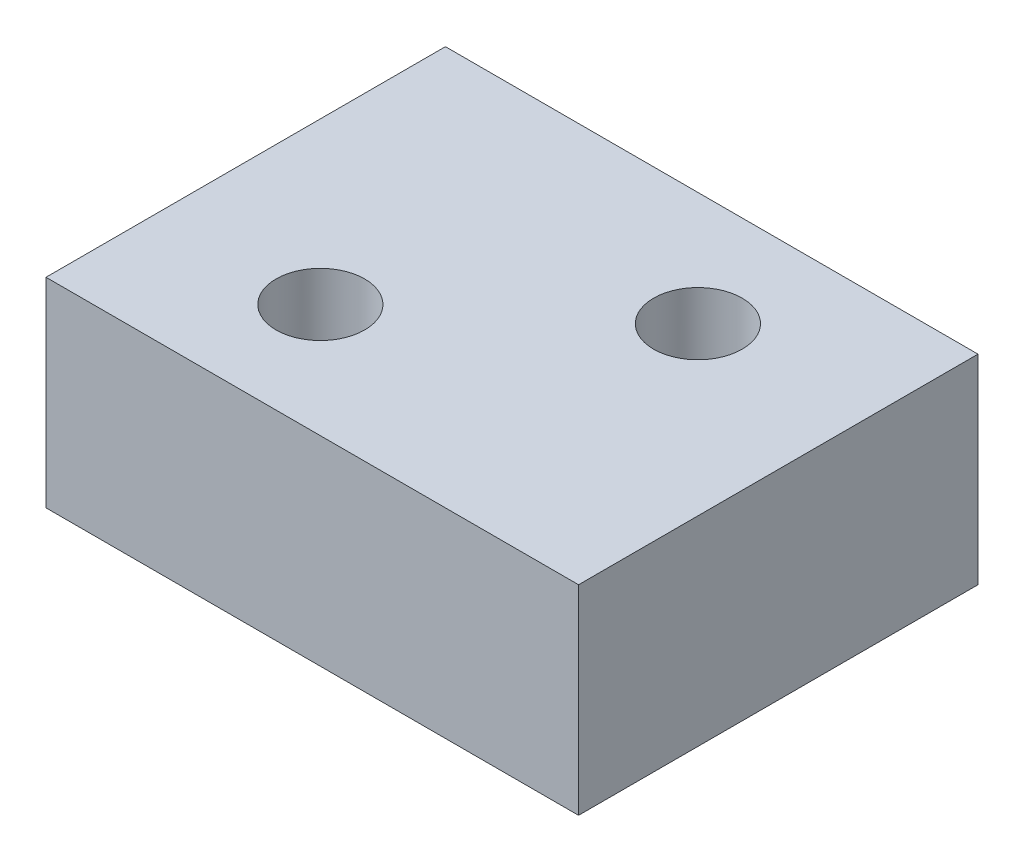
ISO-10303-21;
HEADER;
FILE_DESCRIPTION(('STEP AP214'),'2;1');
FILE_NAME('part.step','',(''),(''),'','','');
FILE_SCHEMA(('AUTOMOTIVE_DESIGN { 1 0 10303 214 1 1 1 1 }'));
ENDSEC;
DATA;
#1=APPLICATION_CONTEXT('core data for automotive mechanical design processes');
#2=APPLICATION_PROTOCOL_DEFINITION('international standard','automotive_design',2000,#1);
#3=PRODUCT_CONTEXT('',#1,'mechanical');
#4=PRODUCT('Part','Part','',(#3));
#5=PRODUCT_RELATED_PRODUCT_CATEGORY('part','',(#4));
#6=PRODUCT_DEFINITION_FORMATION('','',#4);
#7=PRODUCT_DEFINITION_CONTEXT('part definition',#1,'design');
#8=PRODUCT_DEFINITION('design','',#6,#7);
#9=PRODUCT_DEFINITION_SHAPE('','',#8);
#10=(LENGTH_UNIT() NAMED_UNIT(*) SI_UNIT(.MILLI.,.METRE.));
#11=(NAMED_UNIT(*) PLANE_ANGLE_UNIT() SI_UNIT($,.RADIAN.));
#12=(NAMED_UNIT(*) SI_UNIT($,.STERADIAN.) SOLID_ANGLE_UNIT());
#13=UNCERTAINTY_MEASURE_WITH_UNIT(LENGTH_MEASURE(1.E-05),#10,'distance_accuracy_value','');
#14=(GEOMETRIC_REPRESENTATION_CONTEXT(3) GLOBAL_UNCERTAINTY_ASSIGNED_CONTEXT((#13)) GLOBAL_UNIT_ASSIGNED_CONTEXT((#10,
#11,#12)) REPRESENTATION_CONTEXT('',''));
#15=CARTESIAN_POINT('',(0.,0.,0.));
#16=DIRECTION('',(0.,0.,1.));
#17=DIRECTION('',(1.,0.,0.));
#18=AXIS2_PLACEMENT_3D('',#15,#16,#17);
#19=CARTESIAN_POINT('',(20.,10.,15.));
#20=DIRECTION('',(-1.,0.,0.));
#21=DIRECTION('',(0.,0.,1.));
#22=AXIS2_PLACEMENT_3D('',#19,#20,#21);
#23=PLANE('',#22);
#24=DIRECTION('',(0.,0.,-1.));
#25=VECTOR('',#24,1.);
#26=CARTESIAN_POINT('',(20.,0.,15.));
#27=LINE('',#26,#25);
#28=CARTESIAN_POINT('',(20.,0.,15.));
#29=VERTEX_POINT('',#28);
#30=CARTESIAN_POINT('',(20.,0.,-15.));
#31=VERTEX_POINT('',#30);
#32=EDGE_CURVE('E167',#29,#31,#27,.T.);
#33=ORIENTED_EDGE('',*,*,#32,.T.);
#34=DIRECTION('',(0.,-1.,0.));
#35=VECTOR('',#34,1.);
#36=CARTESIAN_POINT('',(20.,10.,-15.));
#37=LINE('',#36,#35);
#38=CARTESIAN_POINT('',(20.,15.,-15.));
#39=VERTEX_POINT('',#38);
#40=EDGE_CURVE('E11',#39,#31,#37,.T.);
#41=ORIENTED_EDGE('',*,*,#40,.F.);
#42=DIRECTION('',(0.,0.,-1.));
#43=VECTOR('',#42,1.);
#44=CARTESIAN_POINT('',(20.,15.,15.));
#45=LINE('',#44,#43);
#46=CARTESIAN_POINT('',(20.,15.,15.));
#47=VERTEX_POINT('',#46);
#48=EDGE_CURVE('E104',#47,#39,#45,.T.);
#49=ORIENTED_EDGE('',*,*,#48,.F.);
#50=DIRECTION('',(0.,-1.,0.));
#51=VECTOR('',#50,1.);
#52=CARTESIAN_POINT('',(20.,10.,15.));
#53=LINE('',#52,#51);
#54=EDGE_CURVE('E95',#47,#29,#53,.T.);
#55=ORIENTED_EDGE('',*,*,#54,.T.);
#56=EDGE_LOOP('',(#33,#41,#49,#55));
#57=FACE_BOUND('',#56,.T.);
#58=ADVANCED_FACE('F47',(#57),#23,.F.);
#59=CARTESIAN_POINT('',(-20.,10.,-15.));
#60=DIRECTION('',(0.,0.,1.));
#61=DIRECTION('',(1.,0.,0.));
#62=AXIS2_PLACEMENT_3D('',#59,#60,#61);
#63=PLANE('',#62);
#64=DIRECTION('',(-1.,0.,0.));
#65=VECTOR('',#64,1.);
#66=CARTESIAN_POINT('',(-20.,0.,-15.));
#67=LINE('',#66,#65);
#68=CARTESIAN_POINT('',(-20.,0.,-15.));
#69=VERTEX_POINT('',#68);
#70=EDGE_CURVE('E174',#31,#69,#67,.T.);
#71=ORIENTED_EDGE('',*,*,#70,.T.);
#72=DIRECTION('',(0.,-1.,0.));
#73=VECTOR('',#72,1.);
#74=CARTESIAN_POINT('',(-20.,10.,-15.));
#75=LINE('',#74,#73);
#76=CARTESIAN_POINT('',(-20.,15.,-15.));
#77=VERTEX_POINT('',#76);
#78=EDGE_CURVE('E56',#77,#69,#75,.T.);
#79=ORIENTED_EDGE('',*,*,#78,.F.);
#80=DIRECTION('',(-1.,0.,0.));
#81=VECTOR('',#80,1.);
#82=CARTESIAN_POINT('',(-20.,15.,-15.));
#83=LINE('',#82,#81);
#84=EDGE_CURVE('E109',#39,#77,#83,.T.);
#85=ORIENTED_EDGE('',*,*,#84,.F.);
#86=ORIENTED_EDGE('',*,*,#40,.T.);
#87=EDGE_LOOP('',(#71,#79,#85,#86));
#88=FACE_BOUND('',#87,.T.);
#89=ADVANCED_FACE('F235',(#88),#63,.F.);
#90=CARTESIAN_POINT('',(-20.,10.,15.));
#91=DIRECTION('',(1.,0.,0.));
#92=DIRECTION('',(0.,0.,-1.));
#93=AXIS2_PLACEMENT_3D('',#90,#91,#92);
#94=PLANE('',#93);
#95=DIRECTION('',(0.,0.,1.));
#96=VECTOR('',#95,1.);
#97=CARTESIAN_POINT('',(-20.,0.,15.));
#98=LINE('',#97,#96);
#99=CARTESIAN_POINT('',(-20.,0.,15.));
#100=VERTEX_POINT('',#99);
#101=EDGE_CURVE('E72',#69,#100,#98,.T.);
#102=ORIENTED_EDGE('',*,*,#101,.T.);
#103=DIRECTION('',(0.,-1.,0.));
#104=VECTOR('',#103,1.);
#105=CARTESIAN_POINT('',(-20.,10.,15.));
#106=LINE('',#105,#104);
#107=CARTESIAN_POINT('',(-20.,15.,15.));
#108=VERTEX_POINT('',#107);
#109=EDGE_CURVE('E89',#108,#100,#106,.T.);
#110=ORIENTED_EDGE('',*,*,#109,.F.);
#111=DIRECTION('',(0.,0.,1.));
#112=VECTOR('',#111,1.);
#113=CARTESIAN_POINT('',(-20.,15.,15.));
#114=LINE('',#113,#112);
#115=EDGE_CURVE('E93',#77,#108,#114,.T.);
#116=ORIENTED_EDGE('',*,*,#115,.F.);
#117=ORIENTED_EDGE('',*,*,#78,.T.);
#118=EDGE_LOOP('',(#102,#110,#116,#117));
#119=FACE_BOUND('',#118,.T.);
#120=ADVANCED_FACE('F91',(#119),#94,.F.);
#121=CARTESIAN_POINT('',(-20.,10.,15.));
#122=DIRECTION('',(0.,0.,-1.));
#123=DIRECTION('',(-1.,0.,0.));
#124=AXIS2_PLACEMENT_3D('',#121,#122,#123);
#125=PLANE('',#124);
#126=DIRECTION('',(1.,0.,0.));
#127=VECTOR('',#126,1.);
#128=CARTESIAN_POINT('',(-20.,0.,15.));
#129=LINE('',#128,#127);
#130=EDGE_CURVE('E64',#100,#29,#129,.T.);
#131=ORIENTED_EDGE('',*,*,#130,.T.);
#132=ORIENTED_EDGE('',*,*,#54,.F.);
#133=DIRECTION('',(1.,0.,0.));
#134=VECTOR('',#133,1.);
#135=CARTESIAN_POINT('',(-20.,15.,15.));
#136=LINE('',#135,#134);
#137=EDGE_CURVE('E98',#108,#47,#136,.T.);
#138=ORIENTED_EDGE('',*,*,#137,.F.);
#139=ORIENTED_EDGE('',*,*,#109,.T.);
#140=EDGE_LOOP('',(#131,#132,#138,#139));
#141=FACE_BOUND('',#140,.T.);
#142=ADVANCED_FACE('F99',(#141),#125,.F.);
#143=CARTESIAN_POINT('',(0.,0.,0.));
#144=DIRECTION('',(0.,-1.,0.));
#145=DIRECTION('',(0.,0.,-1.));
#146=AXIS2_PLACEMENT_3D('',#143,#144,#145);
#147=PLANE('',#146);
#148=CARTESIAN_POINT('',(-13.3333333333333,0.,10.));
#149=DIRECTION('',(0.,-1.,0.));
#150=DIRECTION('',(0.,0.,1.));
#151=AXIS2_PLACEMENT_3D('',#148,#149,#150);
#152=CIRCLE('',#151,2.);
#153=CARTESIAN_POINT('',(-13.3333333333333,0.,12.));
#154=VERTEX_POINT('',#153);
#155=EDGE_CURVE('E147',#154,#154,#152,.T.);
#156=ORIENTED_EDGE('',*,*,#155,.F.);
#157=EDGE_LOOP('',(#156));
#158=FACE_BOUND('',#157,.T.);
#159=CARTESIAN_POINT('',(13.3333333333333,0.,-10.));
#160=DIRECTION('',(0.,-1.,0.));
#161=DIRECTION('',(0.,0.,1.));
#162=AXIS2_PLACEMENT_3D('',#159,#160,#161);
#163=CIRCLE('',#162,2.);
#164=CARTESIAN_POINT('',(13.3333333333333,0.,-8.));
#165=VERTEX_POINT('',#164);
#166=EDGE_CURVE('E156',#165,#165,#163,.T.);
#167=ORIENTED_EDGE('',*,*,#166,.F.);
#168=EDGE_LOOP('',(#167));
#169=FACE_BOUND('',#168,.T.);
#170=CARTESIAN_POINT('',(-13.3333333333333,0.,-9.99999999999999));
#171=DIRECTION('',(0.,-1.,0.));
#172=DIRECTION('',(0.,0.,-1.));
#173=AXIS2_PLACEMENT_3D('',#170,#171,#172);
#174=CIRCLE('',#173,2.);
#175=CARTESIAN_POINT('',(-13.3333333333333,0.,-12.));
#176=VERTEX_POINT('',#175);
#177=EDGE_CURVE('E139',#176,#176,#174,.T.);
#178=ORIENTED_EDGE('',*,*,#177,.F.);
#179=EDGE_LOOP('',(#178));
#180=FACE_BOUND('',#179,.T.);
#181=CARTESIAN_POINT('',(13.3333333333333,0.,10.));
#182=DIRECTION('',(0.,-1.,0.));
#183=DIRECTION('',(0.,0.,-1.));
#184=AXIS2_PLACEMENT_3D('',#181,#182,#183);
#185=CIRCLE('',#184,2.);
#186=CARTESIAN_POINT('',(13.3333333333333,0.,8.));
#187=VERTEX_POINT('',#186);
#188=EDGE_CURVE('E151',#187,#187,#185,.T.);
#189=ORIENTED_EDGE('',*,*,#188,.F.);
#190=EDGE_LOOP('',(#189));
#191=FACE_BOUND('',#190,.T.);
#192=ORIENTED_EDGE('',*,*,#32,.F.);
#193=ORIENTED_EDGE('',*,*,#130,.F.);
#194=ORIENTED_EDGE('',*,*,#101,.F.);
#195=ORIENTED_EDGE('',*,*,#70,.F.);
#196=EDGE_LOOP('',(#192,#193,#194,#195));
#197=FACE_BOUND('',#196,.T.);
#198=ADVANCED_FACE('F244',(#158,#169,#180,#191,#197),#147,.T.);
#199=CARTESIAN_POINT('',(13.3333333333333,5.,10.));
#200=DIRECTION('',(0.,-1.,0.));
#201=DIRECTION('',(0.,0.,-1.));
#202=AXIS2_PLACEMENT_3D('',#199,#200,#201);
#203=CYLINDRICAL_SURFACE('',#202,2.);
#204=CARTESIAN_POINT('',(13.3333333333333,5.,10.));
#205=DIRECTION('',(0.,-1.,0.));
#206=DIRECTION('',(0.,0.,-1.));
#207=AXIS2_PLACEMENT_3D('',#204,#205,#206);
#208=CIRCLE('',#207,2.);
#209=CARTESIAN_POINT('',(13.3333333333333,5.,8.));
#210=VERTEX_POINT('',#209);
#211=EDGE_CURVE('E163',#210,#210,#208,.T.);
#212=ORIENTED_EDGE('',*,*,#211,.F.);
#213=EDGE_LOOP('',(#212));
#214=FACE_BOUND('',#213,.T.);
#215=ORIENTED_EDGE('',*,*,#188,.T.);
#216=EDGE_LOOP('',(#215));
#217=FACE_BOUND('',#216,.T.);
#218=ADVANCED_FACE('F246',(#214,#217),#203,.F.);
#219=CARTESIAN_POINT('',(13.3333333333333,5.,10.));
#220=DIRECTION('',(0.,-1.,0.));
#221=DIRECTION('',(0.,0.,-1.));
#222=AXIS2_PLACEMENT_3D('',#219,#220,#221);
#223=PLANE('',#222);
#224=ORIENTED_EDGE('',*,*,#211,.T.);
#225=EDGE_LOOP('',(#224));
#226=FACE_BOUND('',#225,.T.);
#227=ADVANCED_FACE('F252',(#226),#223,.T.);
#228=CARTESIAN_POINT('',(-13.3333333333333,5.,-9.99999999999999));
#229=DIRECTION('',(0.,-1.,0.));
#230=DIRECTION('',(0.,0.,-1.));
#231=AXIS2_PLACEMENT_3D('',#228,#229,#230);
#232=CYLINDRICAL_SURFACE('',#231,2.);
#233=CARTESIAN_POINT('',(-13.3333333333333,5.,-9.99999999999999));
#234=DIRECTION('',(0.,-1.,0.));
#235=DIRECTION('',(0.,0.,-1.));
#236=AXIS2_PLACEMENT_3D('',#233,#234,#235);
#237=CIRCLE('',#236,2.);
#238=CARTESIAN_POINT('',(-13.3333333333333,5.,-12.));
#239=VERTEX_POINT('',#238);
#240=EDGE_CURVE('E127',#239,#239,#237,.T.);
#241=ORIENTED_EDGE('',*,*,#240,.F.);
#242=EDGE_LOOP('',(#241));
#243=FACE_BOUND('',#242,.T.);
#244=ORIENTED_EDGE('',*,*,#177,.T.);
#245=EDGE_LOOP('',(#244));
#246=FACE_BOUND('',#245,.T.);
#247=ADVANCED_FACE('F372',(#243,#246),#232,.F.);
#248=CARTESIAN_POINT('',(-13.3333333333333,5.,-9.99999999999999));
#249=DIRECTION('',(0.,-1.,0.));
#250=DIRECTION('',(0.,0.,-1.));
#251=AXIS2_PLACEMENT_3D('',#248,#249,#250);
#252=PLANE('',#251);
#253=ORIENTED_EDGE('',*,*,#240,.T.);
#254=EDGE_LOOP('',(#253));
#255=FACE_BOUND('',#254,.T.);
#256=ADVANCED_FACE('F375',(#255),#252,.T.);
#257=CARTESIAN_POINT('',(13.3333333333333,5.,-10.));
#258=DIRECTION('',(0.,-1.,0.));
#259=DIRECTION('',(0.,0.,-1.));
#260=AXIS2_PLACEMENT_3D('',#257,#258,#259);
#261=CYLINDRICAL_SURFACE('',#260,2.);
#262=CARTESIAN_POINT('',(13.3333333333333,5.,-10.));
#263=DIRECTION('',(0.,-1.,0.));
#264=DIRECTION('',(0.,0.,1.));
#265=AXIS2_PLACEMENT_3D('',#262,#263,#264);
#266=CIRCLE('',#265,2.);
#267=CARTESIAN_POINT('',(13.3333333333333,5.,-8.));
#268=VERTEX_POINT('',#267);
#269=EDGE_CURVE('E143',#268,#268,#266,.T.);
#270=ORIENTED_EDGE('',*,*,#269,.F.);
#271=EDGE_LOOP('',(#270));
#272=FACE_BOUND('',#271,.T.);
#273=ORIENTED_EDGE('',*,*,#166,.T.);
#274=EDGE_LOOP('',(#273));
#275=FACE_BOUND('',#274,.T.);
#276=ADVANCED_FACE('F379',(#272,#275),#261,.F.);
#277=CARTESIAN_POINT('',(13.3333333333333,5.,-10.));
#278=DIRECTION('',(0.,1.,0.));
#279=DIRECTION('',(0.,0.,1.));
#280=AXIS2_PLACEMENT_3D('',#277,#278,#279);
#281=PLANE('',#280);
#282=ORIENTED_EDGE('',*,*,#269,.T.);
#283=EDGE_LOOP('',(#282));
#284=FACE_BOUND('',#283,.T.);
#285=ADVANCED_FACE('F384',(#284),#281,.F.);
#286=CARTESIAN_POINT('',(-13.3333333333333,5.,10.));
#287=DIRECTION('',(0.,-1.,0.));
#288=DIRECTION('',(0.,0.,-1.));
#289=AXIS2_PLACEMENT_3D('',#286,#287,#288);
#290=CYLINDRICAL_SURFACE('',#289,2.);
#291=CARTESIAN_POINT('',(-13.3333333333333,5.,10.));
#292=DIRECTION('',(0.,-1.,0.));
#293=DIRECTION('',(0.,0.,1.));
#294=AXIS2_PLACEMENT_3D('',#291,#292,#293);
#295=CIRCLE('',#294,2.);
#296=CARTESIAN_POINT('',(-13.3333333333333,5.,12.));
#297=VERTEX_POINT('',#296);
#298=EDGE_CURVE('E152',#297,#297,#295,.T.);
#299=ORIENTED_EDGE('',*,*,#298,.F.);
#300=EDGE_LOOP('',(#299));
#301=FACE_BOUND('',#300,.T.);
#302=ORIENTED_EDGE('',*,*,#155,.T.);
#303=EDGE_LOOP('',(#302));
#304=FACE_BOUND('',#303,.T.);
#305=ADVANCED_FACE('F381',(#301,#304),#290,.F.);
#306=CARTESIAN_POINT('',(-13.3333333333333,5.,10.));
#307=DIRECTION('',(0.,1.,0.));
#308=DIRECTION('',(0.,0.,1.));
#309=AXIS2_PLACEMENT_3D('',#306,#307,#308);
#310=PLANE('',#309);
#311=ORIENTED_EDGE('',*,*,#298,.T.);
#312=EDGE_LOOP('',(#311));
#313=FACE_BOUND('',#312,.T.);
#314=ADVANCED_FACE('F277',(#313),#310,.F.);
#315=CARTESIAN_POINT('',(0.,15.,0.));
#316=DIRECTION('',(0.,-1.,0.));
#317=DIRECTION('',(0.,0.,-1.));
#318=AXIS2_PLACEMENT_3D('',#315,#316,#317);
#319=PLANE('',#318);
#320=CARTESIAN_POINT('',(-7.9286,15.,6.465));
#321=DIRECTION('',(0.,1.,0.));
#322=DIRECTION('',(0.,0.,1.));
#323=AXIS2_PLACEMENT_3D('',#320,#321,#322);
#324=CIRCLE('',#323,3.325);
#325=CARTESIAN_POINT('',(-7.9286,15.,9.79));
#326=VERTEX_POINT('',#325);
#327=EDGE_CURVE('E188',#326,#326,#324,.T.);
#328=ORIENTED_EDGE('',*,*,#327,.F.);
#329=EDGE_LOOP('',(#328));
#330=FACE_BOUND('',#329,.T.);
#331=CARTESIAN_POINT('',(7.5,15.,-6.4636));
#332=DIRECTION('',(0.,1.,0.));
#333=DIRECTION('',(0.,0.,1.));
#334=AXIS2_PLACEMENT_3D('',#331,#332,#333);
#335=CIRCLE('',#334,3.325);
#336=CARTESIAN_POINT('',(7.5,15.,-3.1386));
#337=VERTEX_POINT('',#336);
#338=EDGE_CURVE('E204',#337,#337,#335,.T.);
#339=ORIENTED_EDGE('',*,*,#338,.F.);
#340=EDGE_LOOP('',(#339));
#341=FACE_BOUND('',#340,.T.);
#342=ORIENTED_EDGE('',*,*,#115,.T.);
#343=ORIENTED_EDGE('',*,*,#137,.T.);
#344=ORIENTED_EDGE('',*,*,#48,.T.);
#345=ORIENTED_EDGE('',*,*,#84,.T.);
#346=EDGE_LOOP('',(#342,#343,#344,#345));
#347=FACE_BOUND('',#346,.T.);
#348=ADVANCED_FACE('F107',(#330,#341,#347),#319,.F.);
#349=CARTESIAN_POINT('',(7.5,15.,-6.4636));
#350=DIRECTION('',(0.,-1.,0.));
#351=DIRECTION('',(0.,0.,-1.));
#352=AXIS2_PLACEMENT_3D('',#349,#350,#351);
#353=CYLINDRICAL_SURFACE('',#352,3.325);
#354=CARTESIAN_POINT('',(7.5,10.,-6.4636));
#355=DIRECTION('',(0.,-1.,0.));
#356=DIRECTION('',(0.,0.,-1.));
#357=AXIS2_PLACEMENT_3D('',#354,#355,#356);
#358=CIRCLE('',#357,3.325);
#359=CARTESIAN_POINT('',(7.5,10.,-9.7886));
#360=VERTEX_POINT('',#359);
#361=EDGE_CURVE('E184',#360,#360,#358,.F.);
#362=ORIENTED_EDGE('',*,*,#361,.F.);
#363=EDGE_LOOP('',(#362));
#364=FACE_BOUND('',#363,.T.);
#365=ORIENTED_EDGE('',*,*,#338,.T.);
#366=EDGE_LOOP('',(#365));
#367=FACE_BOUND('',#366,.T.);
#368=ADVANCED_FACE('F219',(#364,#367),#353,.F.);
#369=CARTESIAN_POINT('',(-7.9286,15.,6.465));
#370=DIRECTION('',(0.,-1.,0.));
#371=DIRECTION('',(0.,0.,-1.));
#372=AXIS2_PLACEMENT_3D('',#369,#370,#371);
#373=CYLINDRICAL_SURFACE('',#372,3.325);
#374=CARTESIAN_POINT('',(-7.9286,10.,6.465));
#375=DIRECTION('',(0.,-1.,0.));
#376=DIRECTION('',(0.,0.,-1.));
#377=AXIS2_PLACEMENT_3D('',#374,#375,#376);
#378=CIRCLE('',#377,3.325);
#379=CARTESIAN_POINT('',(-7.9286,10.,3.14));
#380=VERTEX_POINT('',#379);
#381=EDGE_CURVE('E50',#380,#380,#378,.F.);
#382=ORIENTED_EDGE('',*,*,#381,.F.);
#383=EDGE_LOOP('',(#382));
#384=FACE_BOUND('',#383,.T.);
#385=ORIENTED_EDGE('',*,*,#327,.T.);
#386=EDGE_LOOP('',(#385));
#387=FACE_BOUND('',#386,.T.);
#388=ADVANCED_FACE('F232',(#384,#387),#373,.F.);
#389=CARTESIAN_POINT('',(7.5,6.,-6.4636));
#390=DIRECTION('',(0.,1.,0.));
#391=DIRECTION('',(0.,0.,1.));
#392=AXIS2_PLACEMENT_3D('',#389,#390,#391);
#393=PLANE('',#392);
#394=CARTESIAN_POINT('',(7.5,6.,-6.4636));
#395=DIRECTION('',(0.,1.,0.));
#396=DIRECTION('',(0.,0.,1.));
#397=AXIS2_PLACEMENT_3D('',#394,#395,#396);
#398=CIRCLE('',#397,3.325);
#399=CARTESIAN_POINT('',(7.5,6.,-3.1386));
#400=VERTEX_POINT('',#399);
#401=EDGE_CURVE('E187',#400,#400,#398,.F.);
#402=ORIENTED_EDGE('',*,*,#401,.T.);
#403=EDGE_LOOP('',(#402));
#404=FACE_BOUND('',#403,.T.);
#405=CARTESIAN_POINT('',(7.5,6.,-6.4636));
#406=DIRECTION('',(0.,1.,0.));
#407=DIRECTION('',(0.,0.,1.));
#408=AXIS2_PLACEMENT_3D('',#405,#406,#407);
#409=CIRCLE('',#408,4.8125);
#410=CARTESIAN_POINT('',(7.5,6.,-1.6511));
#411=VERTEX_POINT('',#410);
#412=EDGE_CURVE('E128',#411,#411,#409,.T.);
#413=ORIENTED_EDGE('',*,*,#412,.T.);
#414=EDGE_LOOP('',(#413));
#415=FACE_BOUND('',#414,.T.);
#416=ADVANCED_FACE('F294',(#404,#415),#393,.T.);
#417=CARTESIAN_POINT('',(7.5,6.,-6.4636));
#418=DIRECTION('',(0.,1.,0.));
#419=DIRECTION('',(0.,0.,1.));
#420=AXIS2_PLACEMENT_3D('',#417,#418,#419);
#421=CYLINDRICAL_SURFACE('',#420,4.8125);
#422=ORIENTED_EDGE('',*,*,#412,.F.);
#423=EDGE_LOOP('',(#422));
#424=FACE_BOUND('',#423,.T.);
#425=CARTESIAN_POINT('',(7.5,10.,-6.4636));
#426=DIRECTION('',(0.,1.,0.));
#427=DIRECTION('',(0.,0.,1.));
#428=AXIS2_PLACEMENT_3D('',#425,#426,#427);
#429=CIRCLE('',#428,4.8125);
#430=CARTESIAN_POINT('',(7.5,10.,-1.6511));
#431=VERTEX_POINT('',#430);
#432=EDGE_CURVE('E122',#431,#431,#429,.T.);
#433=ORIENTED_EDGE('',*,*,#432,.T.);
#434=EDGE_LOOP('',(#433));
#435=FACE_BOUND('',#434,.T.);
#436=ADVANCED_FACE('F226',(#424,#435),#421,.F.);
#437=CARTESIAN_POINT('',(0.,10.,0.));
#438=DIRECTION('',(0.,-1.,0.));
#439=DIRECTION('',(0.,0.,-1.));
#440=AXIS2_PLACEMENT_3D('',#437,#438,#439);
#441=PLANE('',#440);
#442=ORIENTED_EDGE('',*,*,#361,.T.);
#443=EDGE_LOOP('',(#442));
#444=FACE_BOUND('',#443,.T.);
#445=ORIENTED_EDGE('',*,*,#432,.F.);
#446=EDGE_LOOP('',(#445));
#447=FACE_BOUND('',#446,.T.);
#448=ADVANCED_FACE('F216',(#444,#447),#441,.T.);
#449=ORIENTED_EDGE('',*,*,#401,.F.);
#450=EDGE_LOOP('',(#449));
#451=FACE_BOUND('',#450,.T.);
#452=CARTESIAN_POINT('',(7.5,5.,-6.4636));
#453=DIRECTION('',(0.,1.,0.));
#454=DIRECTION('',(0.,0.,1.));
#455=AXIS2_PLACEMENT_3D('',#452,#453,#454);
#456=CIRCLE('',#455,3.325);
#457=CARTESIAN_POINT('',(7.5,5.,-3.1386));
#458=VERTEX_POINT('',#457);
#459=EDGE_CURVE('E201',#458,#458,#456,.T.);
#460=ORIENTED_EDGE('',*,*,#459,.F.);
#461=EDGE_LOOP('',(#460));
#462=FACE_BOUND('',#461,.T.);
#463=ADVANCED_FACE('F214',(#451,#462),#353,.F.);
#464=CARTESIAN_POINT('',(7.5,5.,-6.4636));
#465=DIRECTION('',(0.,1.,0.));
#466=DIRECTION('',(0.,0.,1.));
#467=AXIS2_PLACEMENT_3D('',#464,#465,#466);
#468=PLANE('',#467);
#469=ORIENTED_EDGE('',*,*,#459,.T.);
#470=EDGE_LOOP('',(#469));
#471=FACE_BOUND('',#470,.T.);
#472=ADVANCED_FACE('F212',(#471),#468,.T.);
#473=CARTESIAN_POINT('',(-7.9286,6.,6.465));
#474=DIRECTION('',(0.,1.,0.));
#475=DIRECTION('',(0.,0.,1.));
#476=AXIS2_PLACEMENT_3D('',#473,#474,#475);
#477=PLANE('',#476);
#478=CARTESIAN_POINT('',(-7.9286,6.,6.465));
#479=DIRECTION('',(0.,1.,0.));
#480=DIRECTION('',(0.,0.,1.));
#481=AXIS2_PLACEMENT_3D('',#478,#479,#480);
#482=CIRCLE('',#481,3.325);
#483=CARTESIAN_POINT('',(-7.9286,6.,9.79));
#484=VERTEX_POINT('',#483);
#485=EDGE_CURVE('E111',#484,#484,#482,.F.);
#486=ORIENTED_EDGE('',*,*,#485,.T.);
#487=EDGE_LOOP('',(#486));
#488=FACE_BOUND('',#487,.T.);
#489=CARTESIAN_POINT('',(-7.9286,6.,6.465));
#490=DIRECTION('',(0.,1.,0.));
#491=DIRECTION('',(0.,0.,1.));
#492=AXIS2_PLACEMENT_3D('',#489,#490,#491);
#493=CIRCLE('',#492,4.8125);
#494=CARTESIAN_POINT('',(-7.9286,6.,11.2775));
#495=VERTEX_POINT('',#494);
#496=EDGE_CURVE('E123',#495,#495,#493,.T.);
#497=ORIENTED_EDGE('',*,*,#496,.T.);
#498=EDGE_LOOP('',(#497));
#499=FACE_BOUND('',#498,.T.);
#500=ADVANCED_FACE('F224',(#488,#499),#477,.T.);
#501=CARTESIAN_POINT('',(-7.9286,6.,6.465));
#502=DIRECTION('',(0.,1.,0.));
#503=DIRECTION('',(0.,0.,1.));
#504=AXIS2_PLACEMENT_3D('',#501,#502,#503);
#505=CYLINDRICAL_SURFACE('',#504,4.8125);
#506=ORIENTED_EDGE('',*,*,#496,.F.);
#507=EDGE_LOOP('',(#506));
#508=FACE_BOUND('',#507,.T.);
#509=CARTESIAN_POINT('',(-7.9286,10.,6.465));
#510=DIRECTION('',(0.,1.,0.));
#511=DIRECTION('',(0.,0.,1.));
#512=AXIS2_PLACEMENT_3D('',#509,#510,#511);
#513=CIRCLE('',#512,4.8125);
#514=CARTESIAN_POINT('',(-7.9286,10.,11.2775));
#515=VERTEX_POINT('',#514);
#516=EDGE_CURVE('E129',#515,#515,#513,.T.);
#517=ORIENTED_EDGE('',*,*,#516,.T.);
#518=EDGE_LOOP('',(#517));
#519=FACE_BOUND('',#518,.T.);
#520=ADVANCED_FACE('F318',(#508,#519),#505,.F.);
#521=ORIENTED_EDGE('',*,*,#381,.T.);
#522=EDGE_LOOP('',(#521));
#523=FACE_BOUND('',#522,.T.);
#524=ORIENTED_EDGE('',*,*,#516,.F.);
#525=EDGE_LOOP('',(#524));
#526=FACE_BOUND('',#525,.T.);
#527=ADVANCED_FACE('F228',(#523,#526),#441,.T.);
#528=ORIENTED_EDGE('',*,*,#485,.F.);
#529=EDGE_LOOP('',(#528));
#530=FACE_BOUND('',#529,.T.);
#531=CARTESIAN_POINT('',(-7.9286,5.,6.465));
#532=DIRECTION('',(0.,1.,0.));
#533=DIRECTION('',(0.,0.,1.));
#534=AXIS2_PLACEMENT_3D('',#531,#532,#533);
#535=CIRCLE('',#534,3.325);
#536=CARTESIAN_POINT('',(-7.9286,5.,9.79));
#537=VERTEX_POINT('',#536);
#538=EDGE_CURVE('E195',#537,#537,#535,.T.);
#539=ORIENTED_EDGE('',*,*,#538,.F.);
#540=EDGE_LOOP('',(#539));
#541=FACE_BOUND('',#540,.T.);
#542=ADVANCED_FACE('F296',(#530,#541),#373,.F.);
#543=CARTESIAN_POINT('',(-7.9286,5.,6.465));
#544=DIRECTION('',(0.,1.,0.));
#545=DIRECTION('',(0.,0.,1.));
#546=AXIS2_PLACEMENT_3D('',#543,#544,#545);
#547=PLANE('',#546);
#548=ORIENTED_EDGE('',*,*,#538,.T.);
#549=EDGE_LOOP('',(#548));
#550=FACE_BOUND('',#549,.T.);
#551=ADVANCED_FACE('F329',(#550),#547,.T.);
#552=CLOSED_SHELL('',(#58,#89,#120,#142,#198,#218,#227,#247,#256,#276,#285,#305,#314,#348,#368,
#388,#416,#436,#448,#463,#472,#500,#520,#527,#542,#551));
#553=MANIFOLD_SOLID_BREP('B2',#552);
#554=ADVANCED_BREP_SHAPE_REPRESENTATION('',(#18,#553),#14);
#555=SHAPE_DEFINITION_REPRESENTATION(#9,#554);
ENDSEC;
END-ISO-10303-21;
